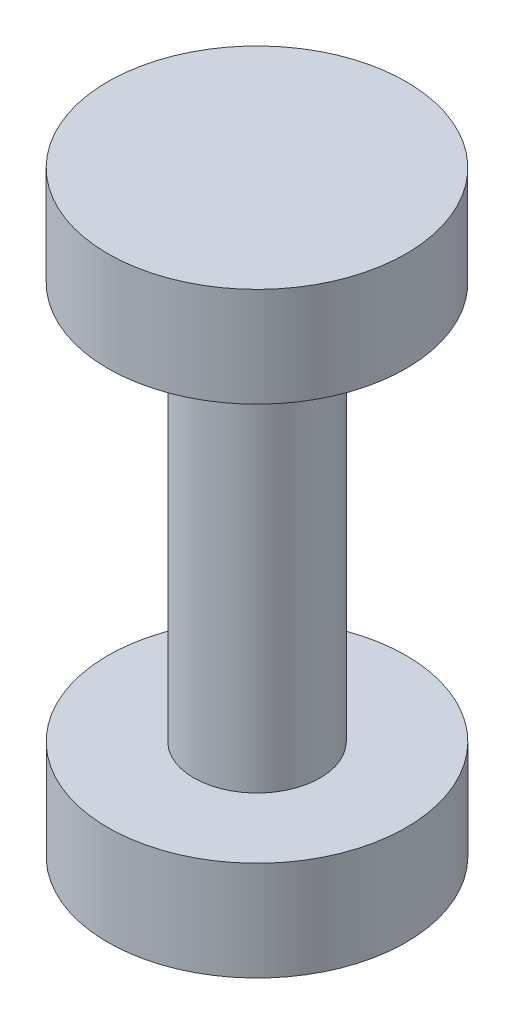
ISO-10303-21;
HEADER;
FILE_DESCRIPTION(('STEP AP214'),'2;1');
FILE_NAME('part.step','',(''),(''),'','','');
FILE_SCHEMA(('AUTOMOTIVE_DESIGN { 1 0 10303 214 1 1 1 1 }'));
ENDSEC;
DATA;
#1=APPLICATION_CONTEXT('core data for automotive mechanical design processes');
#2=APPLICATION_PROTOCOL_DEFINITION('international standard','automotive_design',2000,#1);
#3=PRODUCT_CONTEXT('',#1,'mechanical');
#4=PRODUCT('Part','Part','',(#3));
#5=PRODUCT_RELATED_PRODUCT_CATEGORY('part','',(#4));
#6=PRODUCT_DEFINITION_FORMATION('','',#4);
#7=PRODUCT_DEFINITION_CONTEXT('part definition',#1,'design');
#8=PRODUCT_DEFINITION('design','',#6,#7);
#9=PRODUCT_DEFINITION_SHAPE('','',#8);
#10=(LENGTH_UNIT() NAMED_UNIT(*) SI_UNIT(.MILLI.,.METRE.));
#11=(NAMED_UNIT(*) PLANE_ANGLE_UNIT() SI_UNIT($,.RADIAN.));
#12=(NAMED_UNIT(*) SI_UNIT($,.STERADIAN.) SOLID_ANGLE_UNIT());
#13=UNCERTAINTY_MEASURE_WITH_UNIT(LENGTH_MEASURE(1.E-05),#10,'distance_accuracy_value','');
#14=(GEOMETRIC_REPRESENTATION_CONTEXT(3) GLOBAL_UNCERTAINTY_ASSIGNED_CONTEXT((#13)) GLOBAL_UNIT_ASSIGNED_CONTEXT((#10,
#11,#12)) REPRESENTATION_CONTEXT('',''));
#15=CARTESIAN_POINT('',(0.,0.,0.));
#16=DIRECTION('',(0.,0.,1.));
#17=DIRECTION('',(1.,0.,0.));
#18=AXIS2_PLACEMENT_3D('',#15,#16,#17);
#19=CARTESIAN_POINT('',(0.,20.,0.));
#20=DIRECTION('',(0.,-1.,0.));
#21=DIRECTION('',(0.,0.,-1.));
#22=AXIS2_PLACEMENT_3D('',#19,#20,#21);
#23=CYLINDRICAL_SURFACE('',#22,3.175);
#24=CARTESIAN_POINT('',(0.,20.,0.));
#25=DIRECTION('',(0.,1.,0.));
#26=DIRECTION('',(0.,0.,1.));
#27=AXIS2_PLACEMENT_3D('',#24,#25,#26);
#28=CIRCLE('',#27,3.175);
#29=CARTESIAN_POINT('',(0.,20.,3.175));
#30=VERTEX_POINT('',#29);
#31=EDGE_CURVE('E10',#30,#30,#28,.T.);
#32=ORIENTED_EDGE('',*,*,#31,.F.);
#33=EDGE_LOOP('',(#32));
#34=FACE_BOUND('',#33,.T.);
#35=CARTESIAN_POINT('',(0.,0.,0.));
#36=DIRECTION('',(0.,1.,0.));
#37=DIRECTION('',(0.,0.,1.));
#38=AXIS2_PLACEMENT_3D('',#35,#36,#37);
#39=CIRCLE('',#38,3.175);
#40=CARTESIAN_POINT('',(0.,0.,3.175));
#41=VERTEX_POINT('',#40);
#42=EDGE_CURVE('E38',#41,#41,#39,.T.);
#43=ORIENTED_EDGE('',*,*,#42,.T.);
#44=EDGE_LOOP('',(#43));
#45=FACE_BOUND('',#44,.T.);
#46=ADVANCED_FACE('F35',(#34,#45),#23,.T.);
#47=CARTESIAN_POINT('',(0.,25.,0.));
#48=DIRECTION('',(0.,-1.,0.));
#49=DIRECTION('',(0.,0.,-1.));
#50=AXIS2_PLACEMENT_3D('',#47,#48,#49);
#51=CYLINDRICAL_SURFACE('',#50,7.5);
#52=CARTESIAN_POINT('',(0.,25.,0.));
#53=DIRECTION('',(0.,1.,0.));
#54=DIRECTION('',(0.,0.,1.));
#55=AXIS2_PLACEMENT_3D('',#52,#53,#54);
#56=CIRCLE('',#55,7.5);
#57=CARTESIAN_POINT('',(0.,25.,7.5));
#58=VERTEX_POINT('',#57);
#59=EDGE_CURVE('E42',#58,#58,#56,.T.);
#60=ORIENTED_EDGE('',*,*,#59,.F.);
#61=EDGE_LOOP('',(#60));
#62=FACE_BOUND('',#61,.T.);
#63=CARTESIAN_POINT('',(0.,20.,0.));
#64=DIRECTION('',(0.,1.,0.));
#65=DIRECTION('',(0.,0.,1.));
#66=AXIS2_PLACEMENT_3D('',#63,#64,#65);
#67=CIRCLE('',#66,7.5);
#68=CARTESIAN_POINT('',(0.,20.,7.5));
#69=VERTEX_POINT('',#68);
#70=EDGE_CURVE('E46',#69,#69,#67,.T.);
#71=ORIENTED_EDGE('',*,*,#70,.T.);
#72=EDGE_LOOP('',(#71));
#73=FACE_BOUND('',#72,.T.);
#74=ADVANCED_FACE('F83',(#62,#73),#51,.T.);
#75=CARTESIAN_POINT('',(0.,25.,0.));
#76=DIRECTION('',(0.,1.,0.));
#77=DIRECTION('',(0.,0.,1.));
#78=AXIS2_PLACEMENT_3D('',#75,#76,#77);
#79=PLANE('',#78);
#80=ORIENTED_EDGE('',*,*,#59,.T.);
#81=EDGE_LOOP('',(#80));
#82=FACE_BOUND('',#81,.T.);
#83=ADVANCED_FACE('F79',(#82),#79,.T.);
#84=CARTESIAN_POINT('',(0.,20.,0.));
#85=DIRECTION('',(0.,1.,0.));
#86=DIRECTION('',(0.,0.,1.));
#87=AXIS2_PLACEMENT_3D('',#84,#85,#86);
#88=PLANE('',#87);
#89=ORIENTED_EDGE('',*,*,#31,.T.);
#90=EDGE_LOOP('',(#89));
#91=FACE_BOUND('',#90,.T.);
#92=ORIENTED_EDGE('',*,*,#70,.F.);
#93=EDGE_LOOP('',(#92));
#94=FACE_BOUND('',#93,.T.);
#95=ADVANCED_FACE('F71',(#91,#94),#88,.F.);
#96=CARTESIAN_POINT('',(0.,-5.,0.));
#97=DIRECTION('',(0.,1.,0.));
#98=DIRECTION('',(0.,0.,1.));
#99=AXIS2_PLACEMENT_3D('',#96,#97,#98);
#100=CYLINDRICAL_SURFACE('',#99,7.5);
#101=CARTESIAN_POINT('',(0.,-5.,0.));
#102=DIRECTION('',(0.,-1.,0.));
#103=DIRECTION('',(0.,0.,-1.));
#104=AXIS2_PLACEMENT_3D('',#101,#102,#103);
#105=CIRCLE('',#104,7.5);
#106=CARTESIAN_POINT('',(0.,-5.,-7.5));
#107=VERTEX_POINT('',#106);
#108=EDGE_CURVE('E54',#107,#107,#105,.T.);
#109=ORIENTED_EDGE('',*,*,#108,.F.);
#110=EDGE_LOOP('',(#109));
#111=FACE_BOUND('',#110,.T.);
#112=CARTESIAN_POINT('',(0.,0.,0.));
#113=DIRECTION('',(0.,-1.,0.));
#114=DIRECTION('',(0.,0.,-1.));
#115=AXIS2_PLACEMENT_3D('',#112,#113,#114);
#116=CIRCLE('',#115,7.5);
#117=CARTESIAN_POINT('',(0.,0.,-7.5));
#118=VERTEX_POINT('',#117);
#119=EDGE_CURVE('E51',#118,#118,#116,.T.);
#120=ORIENTED_EDGE('',*,*,#119,.T.);
#121=EDGE_LOOP('',(#120));
#122=FACE_BOUND('',#121,.T.);
#123=ADVANCED_FACE('F69',(#111,#122),#100,.T.);
#124=CARTESIAN_POINT('',(0.,-5.,0.));
#125=DIRECTION('',(0.,-1.,0.));
#126=DIRECTION('',(0.,0.,-1.));
#127=AXIS2_PLACEMENT_3D('',#124,#125,#126);
#128=PLANE('',#127);
#129=ORIENTED_EDGE('',*,*,#108,.T.);
#130=EDGE_LOOP('',(#129));
#131=FACE_BOUND('',#130,.T.);
#132=ADVANCED_FACE('F65',(#131),#128,.T.);
#133=CARTESIAN_POINT('',(0.,0.,0.));
#134=DIRECTION('',(0.,-1.,0.));
#135=DIRECTION('',(0.,0.,-1.));
#136=AXIS2_PLACEMENT_3D('',#133,#134,#135);
#137=PLANE('',#136);
#138=ORIENTED_EDGE('',*,*,#42,.F.);
#139=EDGE_LOOP('',(#138));
#140=FACE_BOUND('',#139,.T.);
#141=ORIENTED_EDGE('',*,*,#119,.F.);
#142=EDGE_LOOP('',(#141));
#143=FACE_BOUND('',#142,.T.);
#144=ADVANCED_FACE('F62',(#140,#143),#137,.F.);
#145=CLOSED_SHELL('',(#46,#74,#83,#95,#123,#132,#144));
#146=MANIFOLD_SOLID_BREP('B2',#145);
#147=ADVANCED_BREP_SHAPE_REPRESENTATION('',(#18,#146),#14);
#148=SHAPE_DEFINITION_REPRESENTATION(#9,#147);
ENDSEC;
END-ISO-10303-21;
